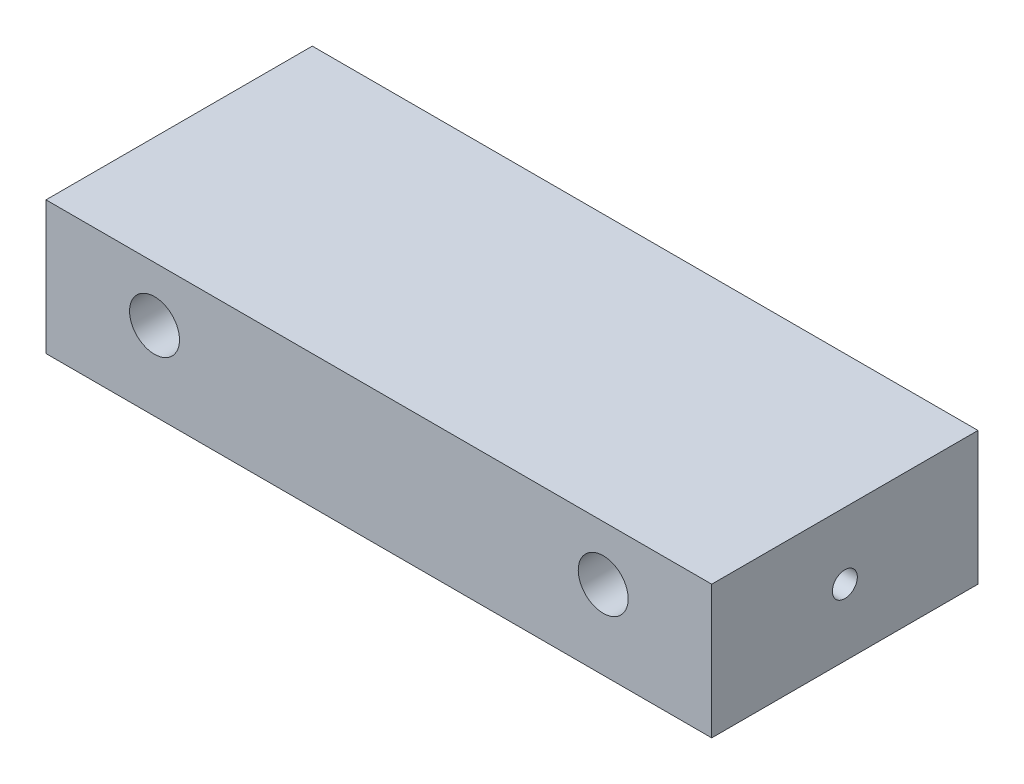
ISO-10303-21;
HEADER;
FILE_DESCRIPTION(('STEP AP214'),'2;1');
FILE_NAME('part.step','',(''),(''),'','','');
FILE_SCHEMA(('AUTOMOTIVE_DESIGN { 1 0 10303 214 1 1 1 1 }'));
ENDSEC;
DATA;
#1=APPLICATION_CONTEXT('core data for automotive mechanical design processes');
#2=APPLICATION_PROTOCOL_DEFINITION('international standard','automotive_design',2000,#1);
#3=PRODUCT_CONTEXT('',#1,'mechanical');
#4=PRODUCT('Part','Part','',(#3));
#5=PRODUCT_RELATED_PRODUCT_CATEGORY('part','',(#4));
#6=PRODUCT_DEFINITION_FORMATION('','',#4);
#7=PRODUCT_DEFINITION_CONTEXT('part definition',#1,'design');
#8=PRODUCT_DEFINITION('design','',#6,#7);
#9=PRODUCT_DEFINITION_SHAPE('','',#8);
#10=(LENGTH_UNIT() NAMED_UNIT(*) SI_UNIT(.MILLI.,.METRE.));
#11=(NAMED_UNIT(*) PLANE_ANGLE_UNIT() SI_UNIT($,.RADIAN.));
#12=(NAMED_UNIT(*) SI_UNIT($,.STERADIAN.) SOLID_ANGLE_UNIT());
#13=UNCERTAINTY_MEASURE_WITH_UNIT(LENGTH_MEASURE(1.E-05),#10,'distance_accuracy_value','');
#14=(GEOMETRIC_REPRESENTATION_CONTEXT(3) GLOBAL_UNCERTAINTY_ASSIGNED_CONTEXT((#13)) GLOBAL_UNIT_ASSIGNED_CONTEXT((#10,
#11,#12)) REPRESENTATION_CONTEXT('',''));
#15=CARTESIAN_POINT('',(0.,0.,0.));
#16=DIRECTION('',(0.,0.,1.));
#17=DIRECTION('',(1.,0.,0.));
#18=AXIS2_PLACEMENT_3D('',#15,#16,#17);
#19=CARTESIAN_POINT('',(127.,-25.3999999999999,101.6));
#20=DIRECTION('',(-1.,0.,0.));
#21=DIRECTION('',(0.,0.,1.));
#22=AXIS2_PLACEMENT_3D('',#19,#20,#21);
#23=PLANE('',#22);
#24=CARTESIAN_POINT('',(127.,0.,50.8));
#25=DIRECTION('',(1.,0.,0.));
#26=DIRECTION('',(0.,0.,-1.));
#27=AXIS2_PLACEMENT_3D('',#24,#25,#26);
#28=CIRCLE('',#27,4.7625);
#29=CARTESIAN_POINT('',(127.,0.,46.0375));
#30=VERTEX_POINT('',#29);
#31=EDGE_CURVE('E135',#30,#30,#28,.T.);
#32=ORIENTED_EDGE('',*,*,#31,.F.);
#33=EDGE_LOOP('',(#32));
#34=FACE_BOUND('',#33,.T.);
#35=DIRECTION('',(0.,1.,0.));
#36=VECTOR('',#35,1.);
#37=CARTESIAN_POINT('',(127.,-25.3999999999999,0.));
#38=LINE('',#37,#36);
#39=CARTESIAN_POINT('',(127.,-25.3999999999999,0.));
#40=VERTEX_POINT('',#39);
#41=CARTESIAN_POINT('',(127.,25.3999999999999,0.));
#42=VERTEX_POINT('',#41);
#43=EDGE_CURVE('E97',#40,#42,#38,.T.);
#44=ORIENTED_EDGE('',*,*,#43,.T.);
#45=DIRECTION('',(0.,0.,-1.));
#46=VECTOR('',#45,1.);
#47=CARTESIAN_POINT('',(127.,25.4000000000001,101.6));
#48=LINE('',#47,#46);
#49=CARTESIAN_POINT('',(127.,25.4000000000001,101.6));
#50=VERTEX_POINT('',#49);
#51=EDGE_CURVE('E11',#50,#42,#48,.T.);
#52=ORIENTED_EDGE('',*,*,#51,.F.);
#53=DIRECTION('',(0.,1.,0.));
#54=VECTOR('',#53,1.);
#55=CARTESIAN_POINT('',(127.,-25.3999999999999,101.6));
#56=LINE('',#55,#54);
#57=CARTESIAN_POINT('',(127.,-25.3999999999999,101.6));
#58=VERTEX_POINT('',#57);
#59=EDGE_CURVE('E85',#58,#50,#56,.T.);
#60=ORIENTED_EDGE('',*,*,#59,.F.);
#61=DIRECTION('',(0.,0.,-1.));
#62=VECTOR('',#61,1.);
#63=CARTESIAN_POINT('',(127.,-25.3999999999999,101.6));
#64=LINE('',#63,#62);
#65=EDGE_CURVE('E93',#58,#40,#64,.T.);
#66=ORIENTED_EDGE('',*,*,#65,.T.);
#67=EDGE_LOOP('',(#44,#52,#60,#66));
#68=FACE_BOUND('',#67,.T.);
#69=ADVANCED_FACE('F34',(#34,#68),#23,.F.);
#70=CARTESIAN_POINT('',(-127.,25.4000000000001,101.6));
#71=DIRECTION('',(0.,-1.,0.));
#72=DIRECTION('',(0.,0.,-1.));
#73=AXIS2_PLACEMENT_3D('',#70,#71,#72);
#74=PLANE('',#73);
#75=DIRECTION('',(-1.,0.,0.));
#76=VECTOR('',#75,1.);
#77=CARTESIAN_POINT('',(-127.,25.3999999999999,0.));
#78=LINE('',#77,#76);
#79=CARTESIAN_POINT('',(-127.,25.3999999999999,0.));
#80=VERTEX_POINT('',#79);
#81=EDGE_CURVE('E89',#42,#80,#78,.T.);
#82=ORIENTED_EDGE('',*,*,#81,.T.);
#83=DIRECTION('',(0.,0.,-1.));
#84=VECTOR('',#83,1.);
#85=CARTESIAN_POINT('',(-127.,25.4000000000001,101.6));
#86=LINE('',#85,#84);
#87=CARTESIAN_POINT('',(-127.,25.4000000000001,101.6));
#88=VERTEX_POINT('',#87);
#89=EDGE_CURVE('E42',#88,#80,#86,.T.);
#90=ORIENTED_EDGE('',*,*,#89,.F.);
#91=DIRECTION('',(-1.,0.,0.));
#92=VECTOR('',#91,1.);
#93=CARTESIAN_POINT('',(-127.,25.4000000000001,101.6));
#94=LINE('',#93,#92);
#95=EDGE_CURVE('E80',#50,#88,#94,.T.);
#96=ORIENTED_EDGE('',*,*,#95,.F.);
#97=ORIENTED_EDGE('',*,*,#51,.T.);
#98=EDGE_LOOP('',(#82,#90,#96,#97));
#99=FACE_BOUND('',#98,.T.);
#100=ADVANCED_FACE('F88',(#99),#74,.F.);
#101=CARTESIAN_POINT('',(-127.,-25.3999999999999,101.6));
#102=DIRECTION('',(1.,0.,0.));
#103=DIRECTION('',(0.,0.,-1.));
#104=AXIS2_PLACEMENT_3D('',#101,#102,#103);
#105=PLANE('',#104);
#106=CARTESIAN_POINT('',(-127.,0.,50.8));
#107=DIRECTION('',(-1.,0.,0.));
#108=DIRECTION('',(0.,0.,1.));
#109=AXIS2_PLACEMENT_3D('',#106,#107,#108);
#110=CIRCLE('',#109,4.7625);
#111=CARTESIAN_POINT('',(-127.,0.,55.5625));
#112=VERTEX_POINT('',#111);
#113=EDGE_CURVE('E141',#112,#112,#110,.T.);
#114=ORIENTED_EDGE('',*,*,#113,.F.);
#115=EDGE_LOOP('',(#114));
#116=FACE_BOUND('',#115,.T.);
#117=DIRECTION('',(0.,-1.,0.));
#118=VECTOR('',#117,1.);
#119=CARTESIAN_POINT('',(-127.,-25.3999999999999,0.));
#120=LINE('',#119,#118);
#121=CARTESIAN_POINT('',(-127.,-25.3999999999999,0.));
#122=VERTEX_POINT('',#121);
#123=EDGE_CURVE('E67',#80,#122,#120,.T.);
#124=ORIENTED_EDGE('',*,*,#123,.T.);
#125=DIRECTION('',(0.,0.,-1.));
#126=VECTOR('',#125,1.);
#127=CARTESIAN_POINT('',(-127.,-25.3999999999999,101.6));
#128=LINE('',#127,#126);
#129=CARTESIAN_POINT('',(-127.,-25.3999999999999,101.6));
#130=VERTEX_POINT('',#129);
#131=EDGE_CURVE('E90',#130,#122,#128,.T.);
#132=ORIENTED_EDGE('',*,*,#131,.F.);
#133=DIRECTION('',(0.,-1.,0.));
#134=VECTOR('',#133,1.);
#135=CARTESIAN_POINT('',(-127.,-25.3999999999999,101.6));
#136=LINE('',#135,#134);
#137=EDGE_CURVE('E83',#88,#130,#136,.T.);
#138=ORIENTED_EDGE('',*,*,#137,.F.);
#139=ORIENTED_EDGE('',*,*,#89,.T.);
#140=EDGE_LOOP('',(#124,#132,#138,#139));
#141=FACE_BOUND('',#140,.T.);
#142=ADVANCED_FACE('F91',(#116,#141),#105,.F.);
#143=CARTESIAN_POINT('',(-127.,-25.3999999999999,101.6));
#144=DIRECTION('',(0.,1.,0.));
#145=DIRECTION('',(0.,0.,1.));
#146=AXIS2_PLACEMENT_3D('',#143,#144,#145);
#147=PLANE('',#146);
#148=DIRECTION('',(1.,0.,0.));
#149=VECTOR('',#148,1.);
#150=CARTESIAN_POINT('',(-127.,-25.3999999999999,0.));
#151=LINE('',#150,#149);
#152=EDGE_CURVE('E73',#122,#40,#151,.T.);
#153=ORIENTED_EDGE('',*,*,#152,.T.);
#154=ORIENTED_EDGE('',*,*,#65,.F.);
#155=DIRECTION('',(1.,0.,0.));
#156=VECTOR('',#155,1.);
#157=CARTESIAN_POINT('',(-127.,-25.3999999999999,101.6));
#158=LINE('',#157,#156);
#159=EDGE_CURVE('E50',#130,#58,#158,.T.);
#160=ORIENTED_EDGE('',*,*,#159,.F.);
#161=ORIENTED_EDGE('',*,*,#131,.T.);
#162=EDGE_LOOP('',(#153,#154,#160,#161));
#163=FACE_BOUND('',#162,.T.);
#164=ADVANCED_FACE('F105',(#163),#147,.F.);
#165=CARTESIAN_POINT('',(0.,0.,101.6));
#166=DIRECTION('',(0.,0.,-1.));
#167=DIRECTION('',(-1.,0.,0.));
#168=AXIS2_PLACEMENT_3D('',#165,#166,#167);
#169=PLANE('',#168);
#170=CARTESIAN_POINT('',(-85.598,4.5974000000002,101.6));
#171=DIRECTION('',(0.,0.,1.));
#172=DIRECTION('',(1.,0.,0.));
#173=AXIS2_PLACEMENT_3D('',#170,#171,#172);
#174=CIRCLE('',#173,9.52500000000001);
#175=CARTESIAN_POINT('',(-76.073,4.5974000000002,101.6));
#176=VERTEX_POINT('',#175);
#177=EDGE_CURVE('E118',#176,#176,#174,.T.);
#178=ORIENTED_EDGE('',*,*,#177,.F.);
#179=EDGE_LOOP('',(#178));
#180=FACE_BOUND('',#179,.T.);
#181=CARTESIAN_POINT('',(85.598,4.5974000000002,101.6));
#182=DIRECTION('',(0.,0.,1.));
#183=DIRECTION('',(-1.,0.,0.));
#184=AXIS2_PLACEMENT_3D('',#181,#182,#183);
#185=CIRCLE('',#184,9.52500000000001);
#186=CARTESIAN_POINT('',(76.073,4.5974000000002,101.6));
#187=VERTEX_POINT('',#186);
#188=EDGE_CURVE('E111',#187,#187,#185,.T.);
#189=ORIENTED_EDGE('',*,*,#188,.F.);
#190=EDGE_LOOP('',(#189));
#191=FACE_BOUND('',#190,.T.);
#192=ORIENTED_EDGE('',*,*,#59,.T.);
#193=ORIENTED_EDGE('',*,*,#95,.T.);
#194=ORIENTED_EDGE('',*,*,#137,.T.);
#195=ORIENTED_EDGE('',*,*,#159,.T.);
#196=EDGE_LOOP('',(#192,#193,#194,#195));
#197=FACE_BOUND('',#196,.T.);
#198=ADVANCED_FACE('F81',(#180,#191,#197),#169,.F.);
#199=CARTESIAN_POINT('',(0.,0.,0.));
#200=DIRECTION('',(0.,0.,-1.));
#201=DIRECTION('',(-1.,0.,0.));
#202=AXIS2_PLACEMENT_3D('',#199,#200,#201);
#203=PLANE('',#202);
#204=CARTESIAN_POINT('',(57.15,0.,0.));
#205=DIRECTION('',(0.,0.,-1.));
#206=DIRECTION('',(-1.,0.,0.));
#207=AXIS2_PLACEMENT_3D('',#204,#205,#206);
#208=CIRCLE('',#207,4.7625);
#209=CARTESIAN_POINT('',(52.3875,0.,0.));
#210=VERTEX_POINT('',#209);
#211=EDGE_CURVE('E130',#210,#210,#208,.T.);
#212=ORIENTED_EDGE('',*,*,#211,.F.);
#213=EDGE_LOOP('',(#212));
#214=FACE_BOUND('',#213,.T.);
#215=CARTESIAN_POINT('',(-57.15,4.44089209850063E-13,0.));
#216=DIRECTION('',(0.,0.,-1.));
#217=DIRECTION('',(1.,0.,0.));
#218=AXIS2_PLACEMENT_3D('',#215,#216,#217);
#219=CIRCLE('',#218,4.7625);
#220=CARTESIAN_POINT('',(-52.3875,4.44089209850063E-13,0.));
#221=VERTEX_POINT('',#220);
#222=EDGE_CURVE('E123',#221,#221,#219,.T.);
#223=ORIENTED_EDGE('',*,*,#222,.F.);
#224=EDGE_LOOP('',(#223));
#225=FACE_BOUND('',#224,.T.);
#226=ORIENTED_EDGE('',*,*,#43,.F.);
#227=ORIENTED_EDGE('',*,*,#152,.F.);
#228=ORIENTED_EDGE('',*,*,#123,.F.);
#229=ORIENTED_EDGE('',*,*,#81,.F.);
#230=EDGE_LOOP('',(#226,#227,#228,#229));
#231=FACE_BOUND('',#230,.T.);
#232=ADVANCED_FACE('F108',(#214,#225,#231),#203,.T.);
#233=CARTESIAN_POINT('',(85.598,4.5974000000002,76.2));
#234=DIRECTION('',(0.,0.,1.));
#235=DIRECTION('',(1.,0.,0.));
#236=AXIS2_PLACEMENT_3D('',#233,#234,#235);
#237=CYLINDRICAL_SURFACE('',#236,9.52500000000001);
#238=CARTESIAN_POINT('',(85.598,4.5974000000002,76.2));
#239=DIRECTION('',(0.,0.,1.));
#240=DIRECTION('',(-1.,0.,0.));
#241=AXIS2_PLACEMENT_3D('',#238,#239,#240);
#242=CIRCLE('',#241,9.52500000000001);
#243=CARTESIAN_POINT('',(76.073,4.5974000000002,76.2));
#244=VERTEX_POINT('',#243);
#245=EDGE_CURVE('E114',#244,#244,#242,.T.);
#246=ORIENTED_EDGE('',*,*,#245,.F.);
#247=EDGE_LOOP('',(#246));
#248=FACE_BOUND('',#247,.T.);
#249=ORIENTED_EDGE('',*,*,#188,.T.);
#250=EDGE_LOOP('',(#249));
#251=FACE_BOUND('',#250,.T.);
#252=ADVANCED_FACE('F207',(#248,#251),#237,.F.);
#253=CARTESIAN_POINT('',(85.598,4.5974000000002,76.2));
#254=DIRECTION('',(0.,0.,-1.));
#255=DIRECTION('',(-1.,0.,0.));
#256=AXIS2_PLACEMENT_3D('',#253,#254,#255);
#257=PLANE('',#256);
#258=ORIENTED_EDGE('',*,*,#245,.T.);
#259=EDGE_LOOP('',(#258));
#260=FACE_BOUND('',#259,.T.);
#261=ADVANCED_FACE('F203',(#260),#257,.F.);
#262=CARTESIAN_POINT('',(-85.598,4.5974000000002,76.2));
#263=DIRECTION('',(0.,0.,1.));
#264=DIRECTION('',(1.,0.,0.));
#265=AXIS2_PLACEMENT_3D('',#262,#263,#264);
#266=CYLINDRICAL_SURFACE('',#265,9.52500000000001);
#267=CARTESIAN_POINT('',(-85.598,4.5974000000002,76.2));
#268=DIRECTION('',(0.,0.,1.));
#269=DIRECTION('',(1.,0.,0.));
#270=AXIS2_PLACEMENT_3D('',#267,#268,#269);
#271=CIRCLE('',#270,9.52500000000001);
#272=CARTESIAN_POINT('',(-76.073,4.5974000000002,76.2));
#273=VERTEX_POINT('',#272);
#274=EDGE_CURVE('E100',#273,#273,#271,.T.);
#275=ORIENTED_EDGE('',*,*,#274,.F.);
#276=EDGE_LOOP('',(#275));
#277=FACE_BOUND('',#276,.T.);
#278=ORIENTED_EDGE('',*,*,#177,.T.);
#279=EDGE_LOOP('',(#278));
#280=FACE_BOUND('',#279,.T.);
#281=ADVANCED_FACE('F199',(#277,#280),#266,.F.);
#282=CARTESIAN_POINT('',(-85.598,4.5974000000002,76.2));
#283=DIRECTION('',(0.,0.,1.));
#284=DIRECTION('',(1.,0.,0.));
#285=AXIS2_PLACEMENT_3D('',#282,#283,#284);
#286=PLANE('',#285);
#287=ORIENTED_EDGE('',*,*,#274,.T.);
#288=EDGE_LOOP('',(#287));
#289=FACE_BOUND('',#288,.T.);
#290=ADVANCED_FACE('F195',(#289),#286,.T.);
#291=CARTESIAN_POINT('',(-57.15,4.44089209850063E-13,25.4));
#292=DIRECTION('',(0.,0.,-1.));
#293=DIRECTION('',(-1.,0.,0.));
#294=AXIS2_PLACEMENT_3D('',#291,#292,#293);
#295=CYLINDRICAL_SURFACE('',#294,4.7625);
#296=CARTESIAN_POINT('',(-57.15,4.44089209850063E-13,25.4));
#297=DIRECTION('',(0.,0.,-1.));
#298=DIRECTION('',(1.,0.,0.));
#299=AXIS2_PLACEMENT_3D('',#296,#297,#298);
#300=CIRCLE('',#299,4.7625);
#301=CARTESIAN_POINT('',(-52.3875,4.44089209850063E-13,25.4));
#302=VERTEX_POINT('',#301);
#303=EDGE_CURVE('E126',#302,#302,#300,.T.);
#304=ORIENTED_EDGE('',*,*,#303,.F.);
#305=EDGE_LOOP('',(#304));
#306=FACE_BOUND('',#305,.T.);
#307=ORIENTED_EDGE('',*,*,#222,.T.);
#308=EDGE_LOOP('',(#307));
#309=FACE_BOUND('',#308,.T.);
#310=ADVANCED_FACE('F191',(#306,#309),#295,.F.);
#311=CARTESIAN_POINT('',(-57.15,4.44089209850063E-13,25.4));
#312=DIRECTION('',(0.,0.,1.));
#313=DIRECTION('',(1.,0.,0.));
#314=AXIS2_PLACEMENT_3D('',#311,#312,#313);
#315=PLANE('',#314);
#316=ORIENTED_EDGE('',*,*,#303,.T.);
#317=EDGE_LOOP('',(#316));
#318=FACE_BOUND('',#317,.T.);
#319=ADVANCED_FACE('F187',(#318),#315,.F.);
#320=CARTESIAN_POINT('',(57.15,0.,25.4));
#321=DIRECTION('',(0.,0.,-1.));
#322=DIRECTION('',(-1.,0.,0.));
#323=AXIS2_PLACEMENT_3D('',#320,#321,#322);
#324=CYLINDRICAL_SURFACE('',#323,4.7625);
#325=CARTESIAN_POINT('',(57.15,0.,25.4));
#326=DIRECTION('',(0.,0.,-1.));
#327=DIRECTION('',(-1.,0.,0.));
#328=AXIS2_PLACEMENT_3D('',#325,#326,#327);
#329=CIRCLE('',#328,4.7625);
#330=CARTESIAN_POINT('',(52.3875,0.,25.4));
#331=VERTEX_POINT('',#330);
#332=EDGE_CURVE('E115',#331,#331,#329,.T.);
#333=ORIENTED_EDGE('',*,*,#332,.F.);
#334=EDGE_LOOP('',(#333));
#335=FACE_BOUND('',#334,.T.);
#336=ORIENTED_EDGE('',*,*,#211,.T.);
#337=EDGE_LOOP('',(#336));
#338=FACE_BOUND('',#337,.T.);
#339=ADVANCED_FACE('F180',(#335,#338),#324,.F.);
#340=CARTESIAN_POINT('',(57.15,0.,25.4));
#341=DIRECTION('',(0.,0.,-1.));
#342=DIRECTION('',(-1.,0.,0.));
#343=AXIS2_PLACEMENT_3D('',#340,#341,#342);
#344=PLANE('',#343);
#345=ORIENTED_EDGE('',*,*,#332,.T.);
#346=EDGE_LOOP('',(#345));
#347=FACE_BOUND('',#346,.T.);
#348=ADVANCED_FACE('F171',(#347),#344,.T.);
#349=CARTESIAN_POINT('',(101.6,0.,50.8));
#350=DIRECTION('',(1.,0.,0.));
#351=DIRECTION('',(0.,0.,-1.));
#352=AXIS2_PLACEMENT_3D('',#349,#350,#351);
#353=CYLINDRICAL_SURFACE('',#352,4.7625);
#354=CARTESIAN_POINT('',(101.6,0.,50.8));
#355=DIRECTION('',(1.,0.,0.));
#356=DIRECTION('',(0.,0.,-1.));
#357=AXIS2_PLACEMENT_3D('',#354,#355,#356);
#358=CIRCLE('',#357,4.7625);
#359=CARTESIAN_POINT('',(101.6,0.,46.0375));
#360=VERTEX_POINT('',#359);
#361=EDGE_CURVE('E127',#360,#360,#358,.T.);
#362=ORIENTED_EDGE('',*,*,#361,.F.);
#363=EDGE_LOOP('',(#362));
#364=FACE_BOUND('',#363,.T.);
#365=ORIENTED_EDGE('',*,*,#31,.T.);
#366=EDGE_LOOP('',(#365));
#367=FACE_BOUND('',#366,.T.);
#368=ADVANCED_FACE('F169',(#364,#367),#353,.F.);
#369=CARTESIAN_POINT('',(101.6,0.,50.8));
#370=DIRECTION('',(1.,0.,0.));
#371=DIRECTION('',(0.,0.,-1.));
#372=AXIS2_PLACEMENT_3D('',#369,#370,#371);
#373=PLANE('',#372);
#374=ORIENTED_EDGE('',*,*,#361,.T.);
#375=EDGE_LOOP('',(#374));
#376=FACE_BOUND('',#375,.T.);
#377=ADVANCED_FACE('F152',(#376),#373,.T.);
#378=CARTESIAN_POINT('',(-101.6,0.,50.8));
#379=DIRECTION('',(-1.,0.,0.));
#380=DIRECTION('',(0.,0.,1.));
#381=AXIS2_PLACEMENT_3D('',#378,#379,#380);
#382=CYLINDRICAL_SURFACE('',#381,4.7625);
#383=CARTESIAN_POINT('',(-101.6,0.,50.8));
#384=DIRECTION('',(-1.,0.,0.));
#385=DIRECTION('',(0.,0.,1.));
#386=AXIS2_PLACEMENT_3D('',#383,#384,#385);
#387=CIRCLE('',#386,4.7625);
#388=CARTESIAN_POINT('',(-101.6,0.,55.5625));
#389=VERTEX_POINT('',#388);
#390=EDGE_CURVE('E138',#389,#389,#387,.T.);
#391=ORIENTED_EDGE('',*,*,#390,.F.);
#392=EDGE_LOOP('',(#391));
#393=FACE_BOUND('',#392,.T.);
#394=ORIENTED_EDGE('',*,*,#113,.T.);
#395=EDGE_LOOP('',(#394));
#396=FACE_BOUND('',#395,.T.);
#397=ADVANCED_FACE('F149',(#393,#396),#382,.F.);
#398=CARTESIAN_POINT('',(-101.6,0.,50.8));
#399=DIRECTION('',(-1.,0.,0.));
#400=DIRECTION('',(0.,0.,1.));
#401=AXIS2_PLACEMENT_3D('',#398,#399,#400);
#402=PLANE('',#401);
#403=ORIENTED_EDGE('',*,*,#390,.T.);
#404=EDGE_LOOP('',(#403));
#405=FACE_BOUND('',#404,.T.);
#406=ADVANCED_FACE('F147',(#405),#402,.T.);
#407=CLOSED_SHELL('',(#69,#100,#142,#164,#198,#232,#252,#261,#281,#290,#310,#319,#339,#348,#368,
#377,#397,#406));
#408=MANIFOLD_SOLID_BREP('B2',#407);
#409=ADVANCED_BREP_SHAPE_REPRESENTATION('',(#18,#408),#14);
#410=SHAPE_DEFINITION_REPRESENTATION(#9,#409);
ENDSEC;
END-ISO-10303-21;
